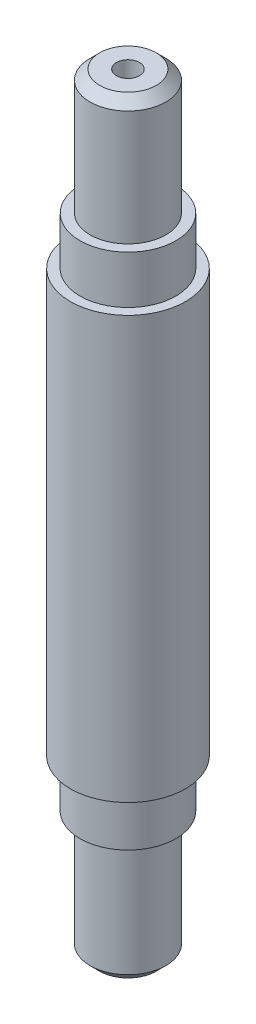
ISO-10303-21;
HEADER;
FILE_DESCRIPTION(('STEP AP214'),'2;1');
FILE_NAME('part.step','',(''),(''),'','','');
FILE_SCHEMA(('AUTOMOTIVE_DESIGN { 1 0 10303 214 1 1 1 1 }'));
ENDSEC;
DATA;
#1=APPLICATION_CONTEXT('core data for automotive mechanical design processes');
#2=APPLICATION_PROTOCOL_DEFINITION('international standard','automotive_design',2000,#1);
#3=PRODUCT_CONTEXT('',#1,'mechanical');
#4=PRODUCT('Part','Part','',(#3));
#5=PRODUCT_RELATED_PRODUCT_CATEGORY('part','',(#4));
#6=PRODUCT_DEFINITION_FORMATION('','',#4);
#7=PRODUCT_DEFINITION_CONTEXT('part definition',#1,'design');
#8=PRODUCT_DEFINITION('design','',#6,#7);
#9=PRODUCT_DEFINITION_SHAPE('','',#8);
#10=(LENGTH_UNIT() NAMED_UNIT(*) SI_UNIT(.MILLI.,.METRE.));
#11=(NAMED_UNIT(*) PLANE_ANGLE_UNIT() SI_UNIT($,.RADIAN.));
#12=(NAMED_UNIT(*) SI_UNIT($,.STERADIAN.) SOLID_ANGLE_UNIT());
#13=UNCERTAINTY_MEASURE_WITH_UNIT(LENGTH_MEASURE(1.E-05),#10,'distance_accuracy_value','');
#14=(GEOMETRIC_REPRESENTATION_CONTEXT(3) GLOBAL_UNCERTAINTY_ASSIGNED_CONTEXT((#13)) GLOBAL_UNIT_ASSIGNED_CONTEXT((#10,
#11,#12)) REPRESENTATION_CONTEXT('',''));
#15=CARTESIAN_POINT('',(0.,0.,0.));
#16=DIRECTION('',(0.,0.,1.));
#17=DIRECTION('',(1.,0.,0.));
#18=AXIS2_PLACEMENT_3D('',#15,#16,#17);
#19=CARTESIAN_POINT('',(0.,18.,0.));
#20=DIRECTION('',(0.,-1.,0.));
#21=DIRECTION('',(0.,0.,-1.));
#22=AXIS2_PLACEMENT_3D('',#19,#20,#21);
#23=CYLINDRICAL_SURFACE('',#22,3.95);
#24=CARTESIAN_POINT('',(0.,17.,0.));
#25=DIRECTION('',(0.,1.,0.));
#26=DIRECTION('',(0.,0.,1.));
#27=AXIS2_PLACEMENT_3D('',#24,#25,#26);
#28=CIRCLE('',#27,3.95);
#29=CARTESIAN_POINT('',(0.,17.,3.95));
#30=VERTEX_POINT('',#29);
#31=EDGE_CURVE('E55',#30,#30,#28,.F.);
#32=ORIENTED_EDGE('',*,*,#31,.T.);
#33=EDGE_LOOP('',(#32));
#34=FACE_BOUND('',#33,.T.);
#35=CARTESIAN_POINT('',(0.,5.,0.));
#36=DIRECTION('',(0.,1.,0.));
#37=DIRECTION('',(0.,0.,1.));
#38=AXIS2_PLACEMENT_3D('',#35,#36,#37);
#39=CIRCLE('',#38,3.95);
#40=CARTESIAN_POINT('',(0.,5.,3.95));
#41=VERTEX_POINT('',#40);
#42=EDGE_CURVE('E85',#41,#41,#39,.T.);
#43=ORIENTED_EDGE('',*,*,#42,.T.);
#44=EDGE_LOOP('',(#43));
#45=FACE_BOUND('',#44,.T.);
#46=ADVANCED_FACE('F41',(#34,#45),#23,.T.);
#47=CARTESIAN_POINT('',(0.,18.,0.));
#48=DIRECTION('',(0.,1.,0.));
#49=DIRECTION('',(0.,0.,1.));
#50=AXIS2_PLACEMENT_3D('',#47,#48,#49);
#51=PLANE('',#50);
#52=CARTESIAN_POINT('',(0.,18.,0.));
#53=DIRECTION('',(0.,1.,0.));
#54=DIRECTION('',(0.,0.,1.));
#55=AXIS2_PLACEMENT_3D('',#52,#53,#54);
#56=CIRCLE('',#55,2.94999999999999);
#57=CARTESIAN_POINT('',(0.,18.,2.94999999999999));
#58=VERTEX_POINT('',#57);
#59=EDGE_CURVE('E60',#58,#58,#56,.T.);
#60=ORIENTED_EDGE('',*,*,#59,.T.);
#61=EDGE_LOOP('',(#60));
#62=FACE_BOUND('',#61,.T.);
#63=CARTESIAN_POINT('',(0.,18.,0.));
#64=DIRECTION('',(0.,1.,0.));
#65=DIRECTION('',(0.,0.,1.));
#66=AXIS2_PLACEMENT_3D('',#63,#64,#65);
#67=CIRCLE('',#66,1.2);
#68=CARTESIAN_POINT('',(0.,18.,1.2));
#69=VERTEX_POINT('',#68);
#70=EDGE_CURVE('E66',#69,#69,#67,.T.);
#71=ORIENTED_EDGE('',*,*,#70,.F.);
#72=EDGE_LOOP('',(#71));
#73=FACE_BOUND('',#72,.T.);
#74=ADVANCED_FACE('F132',(#62,#73),#51,.T.);
#75=CARTESIAN_POINT('',(0.,18.,0.));
#76=DIRECTION('',(0.,-1.,0.));
#77=DIRECTION('',(0.,0.,-1.));
#78=AXIS2_PLACEMENT_3D('',#75,#76,#77);
#79=CYLINDRICAL_SURFACE('',#78,1.2);
#80=ORIENTED_EDGE('',*,*,#70,.T.);
#81=EDGE_LOOP('',(#80));
#82=FACE_BOUND('',#81,.T.);
#83=CARTESIAN_POINT('',(0.,15.5,0.));
#84=DIRECTION('',(0.,1.,0.));
#85=DIRECTION('',(0.,0.,1.));
#86=AXIS2_PLACEMENT_3D('',#83,#84,#85);
#87=CIRCLE('',#86,1.2);
#88=CARTESIAN_POINT('',(0.,15.5,1.2));
#89=VERTEX_POINT('',#88);
#90=EDGE_CURVE('E73',#89,#89,#87,.T.);
#91=ORIENTED_EDGE('',*,*,#90,.F.);
#92=EDGE_LOOP('',(#91));
#93=FACE_BOUND('',#92,.T.);
#94=ADVANCED_FACE('F138',(#82,#93),#79,.F.);
#95=CARTESIAN_POINT('',(0.,15.5,0.));
#96=DIRECTION('',(0.,1.,0.));
#97=DIRECTION('',(0.,0.,1.));
#98=AXIS2_PLACEMENT_3D('',#95,#96,#97);
#99=PLANE('',#98);
#100=ORIENTED_EDGE('',*,*,#90,.T.);
#101=EDGE_LOOP('',(#100));
#102=FACE_BOUND('',#101,.T.);
#103=ADVANCED_FACE('F150',(#102),#99,.T.);
#104=CARTESIAN_POINT('',(0.,5.,0.));
#105=DIRECTION('',(0.,-1.,0.));
#106=DIRECTION('',(0.,0.,-1.));
#107=AXIS2_PLACEMENT_3D('',#104,#105,#106);
#108=CYLINDRICAL_SURFACE('',#107,5.);
#109=CARTESIAN_POINT('',(0.,5.,0.));
#110=DIRECTION('',(0.,1.,0.));
#111=DIRECTION('',(0.,0.,1.));
#112=AXIS2_PLACEMENT_3D('',#109,#110,#111);
#113=CIRCLE('',#112,5.);
#114=CARTESIAN_POINT('',(0.,5.,5.));
#115=VERTEX_POINT('',#114);
#116=EDGE_CURVE('E77',#115,#115,#113,.T.);
#117=ORIENTED_EDGE('',*,*,#116,.F.);
#118=EDGE_LOOP('',(#117));
#119=FACE_BOUND('',#118,.T.);
#120=CARTESIAN_POINT('',(0.,0.,0.));
#121=DIRECTION('',(0.,1.,0.));
#122=DIRECTION('',(0.,0.,1.));
#123=AXIS2_PLACEMENT_3D('',#120,#121,#122);
#124=CIRCLE('',#123,5.);
#125=CARTESIAN_POINT('',(0.,0.,5.));
#126=VERTEX_POINT('',#125);
#127=EDGE_CURVE('E81',#126,#126,#124,.T.);
#128=ORIENTED_EDGE('',*,*,#127,.T.);
#129=EDGE_LOOP('',(#128));
#130=FACE_BOUND('',#129,.T.);
#131=ADVANCED_FACE('F154',(#119,#130),#108,.T.);
#132=CARTESIAN_POINT('',(0.,5.,0.));
#133=DIRECTION('',(0.,1.,0.));
#134=DIRECTION('',(0.,0.,1.));
#135=AXIS2_PLACEMENT_3D('',#132,#133,#134);
#136=PLANE('',#135);
#137=ORIENTED_EDGE('',*,*,#42,.F.);
#138=EDGE_LOOP('',(#137));
#139=FACE_BOUND('',#138,.T.);
#140=ORIENTED_EDGE('',*,*,#116,.T.);
#141=EDGE_LOOP('',(#140));
#142=FACE_BOUND('',#141,.T.);
#143=ADVANCED_FACE('F158',(#139,#142),#136,.T.);
#144=CARTESIAN_POINT('',(0.,-44.,0.));
#145=DIRECTION('',(0.,1.,0.));
#146=DIRECTION('',(0.,0.,1.));
#147=AXIS2_PLACEMENT_3D('',#144,#145,#146);
#148=CYLINDRICAL_SURFACE('',#147,6.);
#149=CARTESIAN_POINT('',(0.,-44.,0.));
#150=DIRECTION('',(0.,1.,0.));
#151=DIRECTION('',(0.,0.,1.));
#152=AXIS2_PLACEMENT_3D('',#149,#150,#151);
#153=CIRCLE('',#152,6.);
#154=CARTESIAN_POINT('',(0.,-44.,6.));
#155=VERTEX_POINT('',#154);
#156=EDGE_CURVE('E86',#155,#155,#153,.T.);
#157=ORIENTED_EDGE('',*,*,#156,.T.);
#158=EDGE_LOOP('',(#157));
#159=FACE_BOUND('',#158,.T.);
#160=CARTESIAN_POINT('',(0.,0.,0.));
#161=DIRECTION('',(0.,1.,0.));
#162=DIRECTION('',(0.,0.,1.));
#163=AXIS2_PLACEMENT_3D('',#160,#161,#162);
#164=CIRCLE('',#163,6.);
#165=CARTESIAN_POINT('',(0.,0.,6.));
#166=VERTEX_POINT('',#165);
#167=EDGE_CURVE('E93',#166,#166,#164,.T.);
#168=ORIENTED_EDGE('',*,*,#167,.F.);
#169=EDGE_LOOP('',(#168));
#170=FACE_BOUND('',#169,.T.);
#171=ADVANCED_FACE('F162',(#159,#170),#148,.T.);
#172=CARTESIAN_POINT('',(0.,-44.,0.));
#173=DIRECTION('',(0.,1.,0.));
#174=DIRECTION('',(0.,0.,1.));
#175=AXIS2_PLACEMENT_3D('',#172,#173,#174);
#176=PLANE('',#175);
#177=CARTESIAN_POINT('',(0.,-44.,0.));
#178=DIRECTION('',(0.,1.,0.));
#179=DIRECTION('',(0.,0.,1.));
#180=AXIS2_PLACEMENT_3D('',#177,#178,#179);
#181=CIRCLE('',#180,5.);
#182=CARTESIAN_POINT('',(0.,-44.,5.));
#183=VERTEX_POINT('',#182);
#184=EDGE_CURVE('E97',#183,#183,#181,.T.);
#185=ORIENTED_EDGE('',*,*,#184,.T.);
#186=EDGE_LOOP('',(#185));
#187=FACE_BOUND('',#186,.T.);
#188=ORIENTED_EDGE('',*,*,#156,.F.);
#189=EDGE_LOOP('',(#188));
#190=FACE_BOUND('',#189,.T.);
#191=ADVANCED_FACE('F166',(#187,#190),#176,.F.);
#192=CARTESIAN_POINT('',(0.,0.,0.));
#193=DIRECTION('',(0.,1.,0.));
#194=DIRECTION('',(0.,0.,1.));
#195=AXIS2_PLACEMENT_3D('',#192,#193,#194);
#196=PLANE('',#195);
#197=ORIENTED_EDGE('',*,*,#127,.F.);
#198=EDGE_LOOP('',(#197));
#199=FACE_BOUND('',#198,.T.);
#200=ORIENTED_EDGE('',*,*,#167,.T.);
#201=EDGE_LOOP('',(#200));
#202=FACE_BOUND('',#201,.T.);
#203=ADVANCED_FACE('F168',(#199,#202),#196,.T.);
#204=CARTESIAN_POINT('',(0.,-49.,0.));
#205=DIRECTION('',(0.,1.,0.));
#206=DIRECTION('',(0.,0.,1.));
#207=AXIS2_PLACEMENT_3D('',#204,#205,#206);
#208=CYLINDRICAL_SURFACE('',#207,5.);
#209=CARTESIAN_POINT('',(0.,-49.,0.));
#210=DIRECTION('',(0.,1.,0.));
#211=DIRECTION('',(0.,0.,1.));
#212=AXIS2_PLACEMENT_3D('',#209,#210,#211);
#213=CIRCLE('',#212,5.);
#214=CARTESIAN_POINT('',(0.,-49.,5.));
#215=VERTEX_POINT('',#214);
#216=EDGE_CURVE('E71',#215,#215,#213,.T.);
#217=ORIENTED_EDGE('',*,*,#216,.T.);
#218=EDGE_LOOP('',(#217));
#219=FACE_BOUND('',#218,.T.);
#220=ORIENTED_EDGE('',*,*,#184,.F.);
#221=EDGE_LOOP('',(#220));
#222=FACE_BOUND('',#221,.T.);
#223=ADVANCED_FACE('F171',(#219,#222),#208,.T.);
#224=CARTESIAN_POINT('',(0.,-49.,0.));
#225=DIRECTION('',(0.,1.,0.));
#226=DIRECTION('',(0.,0.,1.));
#227=AXIS2_PLACEMENT_3D('',#224,#225,#226);
#228=PLANE('',#227);
#229=CARTESIAN_POINT('',(0.,-49.,0.));
#230=DIRECTION('',(0.,1.,0.));
#231=DIRECTION('',(0.,0.,1.));
#232=AXIS2_PLACEMENT_3D('',#229,#230,#231);
#233=CIRCLE('',#232,3.95);
#234=CARTESIAN_POINT('',(0.,-49.,3.95));
#235=VERTEX_POINT('',#234);
#236=EDGE_CURVE('E67',#235,#235,#233,.T.);
#237=ORIENTED_EDGE('',*,*,#236,.T.);
#238=EDGE_LOOP('',(#237));
#239=FACE_BOUND('',#238,.T.);
#240=ORIENTED_EDGE('',*,*,#216,.F.);
#241=EDGE_LOOP('',(#240));
#242=FACE_BOUND('',#241,.T.);
#243=ADVANCED_FACE('F178',(#239,#242),#228,.F.);
#244=CARTESIAN_POINT('',(0.,-62.,0.));
#245=DIRECTION('',(0.,1.,0.));
#246=DIRECTION('',(0.,0.,1.));
#247=AXIS2_PLACEMENT_3D('',#244,#245,#246);
#248=CYLINDRICAL_SURFACE('',#247,3.95);
#249=CARTESIAN_POINT('',(0.,-61.,0.));
#250=DIRECTION('',(0.,1.,0.));
#251=DIRECTION('',(0.,0.,1.));
#252=AXIS2_PLACEMENT_3D('',#249,#250,#251);
#253=CIRCLE('',#252,3.95);
#254=CARTESIAN_POINT('',(0.,-61.,3.95));
#255=VERTEX_POINT('',#254);
#256=EDGE_CURVE('E50',#255,#255,#253,.T.);
#257=ORIENTED_EDGE('',*,*,#256,.T.);
#258=EDGE_LOOP('',(#257));
#259=FACE_BOUND('',#258,.T.);
#260=ORIENTED_EDGE('',*,*,#236,.F.);
#261=EDGE_LOOP('',(#260));
#262=FACE_BOUND('',#261,.T.);
#263=ADVANCED_FACE('F182',(#259,#262),#248,.T.);
#264=CARTESIAN_POINT('',(0.,-62.,0.));
#265=DIRECTION('',(0.,1.,0.));
#266=DIRECTION('',(0.,0.,1.));
#267=AXIS2_PLACEMENT_3D('',#264,#265,#266);
#268=PLANE('',#267);
#269=CARTESIAN_POINT('',(0.,-62.,0.));
#270=DIRECTION('',(0.,1.,0.));
#271=DIRECTION('',(0.,0.,1.));
#272=AXIS2_PLACEMENT_3D('',#269,#270,#271);
#273=CIRCLE('',#272,2.94999999999997);
#274=CARTESIAN_POINT('',(0.,-62.,2.94999999999997));
#275=VERTEX_POINT('',#274);
#276=EDGE_CURVE('E10',#275,#275,#273,.F.);
#277=ORIENTED_EDGE('',*,*,#276,.T.);
#278=EDGE_LOOP('',(#277));
#279=FACE_BOUND('',#278,.T.);
#280=CARTESIAN_POINT('',(0.,-62.,0.));
#281=DIRECTION('',(0.,1.,0.));
#282=DIRECTION('',(0.,0.,1.));
#283=AXIS2_PLACEMENT_3D('',#280,#281,#282);
#284=CIRCLE('',#283,1.2);
#285=CARTESIAN_POINT('',(0.,-62.,1.2));
#286=VERTEX_POINT('',#285);
#287=EDGE_CURVE('E72',#286,#286,#284,.T.);
#288=ORIENTED_EDGE('',*,*,#287,.T.);
#289=EDGE_LOOP('',(#288));
#290=FACE_BOUND('',#289,.T.);
#291=ADVANCED_FACE('F115',(#279,#290),#268,.F.);
#292=CARTESIAN_POINT('',(0.,-62.,0.));
#293=DIRECTION('',(0.,1.,0.));
#294=DIRECTION('',(0.,0.,1.));
#295=AXIS2_PLACEMENT_3D('',#292,#293,#294);
#296=CYLINDRICAL_SURFACE('',#295,1.2);
#297=ORIENTED_EDGE('',*,*,#287,.F.);
#298=EDGE_LOOP('',(#297));
#299=FACE_BOUND('',#298,.T.);
#300=CARTESIAN_POINT('',(0.,-59.5,0.));
#301=DIRECTION('',(0.,1.,0.));
#302=DIRECTION('',(0.,0.,1.));
#303=AXIS2_PLACEMENT_3D('',#300,#301,#302);
#304=CIRCLE('',#303,1.2);
#305=CARTESIAN_POINT('',(0.,-59.5,1.2));
#306=VERTEX_POINT('',#305);
#307=EDGE_CURVE('E107',#306,#306,#304,.T.);
#308=ORIENTED_EDGE('',*,*,#307,.T.);
#309=EDGE_LOOP('',(#308));
#310=FACE_BOUND('',#309,.T.);
#311=ADVANCED_FACE('F117',(#299,#310),#296,.F.);
#312=CARTESIAN_POINT('',(0.,-59.5,0.));
#313=DIRECTION('',(0.,1.,0.));
#314=DIRECTION('',(0.,0.,1.));
#315=AXIS2_PLACEMENT_3D('',#312,#313,#314);
#316=PLANE('',#315);
#317=ORIENTED_EDGE('',*,*,#307,.F.);
#318=EDGE_LOOP('',(#317));
#319=FACE_BOUND('',#318,.T.);
#320=ADVANCED_FACE('F120',(#319),#316,.F.);
#321=CARTESIAN_POINT('',(0.,18.,0.));
#322=DIRECTION('',(0.,-1.,0.));
#323=DIRECTION('',(0.,0.,-1.));
#324=AXIS2_PLACEMENT_3D('',#321,#322,#323);
#325=CONICAL_SURFACE('',#324,2.94999999999999,0.785398163397447);
#326=ORIENTED_EDGE('',*,*,#31,.F.);
#327=EDGE_LOOP('',(#326));
#328=FACE_BOUND('',#327,.T.);
#329=ORIENTED_EDGE('',*,*,#59,.F.);
#330=EDGE_LOOP('',(#329));
#331=FACE_BOUND('',#330,.T.);
#332=ADVANCED_FACE('F125',(#328,#331),#325,.T.);
#333=CARTESIAN_POINT('',(0.,-61.,0.));
#334=DIRECTION('',(0.,1.,0.));
#335=DIRECTION('',(0.,0.,1.));
#336=AXIS2_PLACEMENT_3D('',#333,#334,#335);
#337=CONICAL_SURFACE('',#336,3.95,0.785398163397454);
#338=ORIENTED_EDGE('',*,*,#276,.F.);
#339=EDGE_LOOP('',(#338));
#340=FACE_BOUND('',#339,.T.);
#341=ORIENTED_EDGE('',*,*,#256,.F.);
#342=EDGE_LOOP('',(#341));
#343=FACE_BOUND('',#342,.T.);
#344=ADVANCED_FACE('F44',(#340,#343),#337,.T.);
#345=CLOSED_SHELL('',(#46,#74,#94,#103,#131,#143,#171,#191,#203,#223,#243,#263,#291,#311,#320,
#332,#344));
#346=MANIFOLD_SOLID_BREP('B2',#345);
#347=ADVANCED_BREP_SHAPE_REPRESENTATION('',(#18,#346),#14);
#348=SHAPE_DEFINITION_REPRESENTATION(#9,#347);
ENDSEC;
END-ISO-10303-21;
